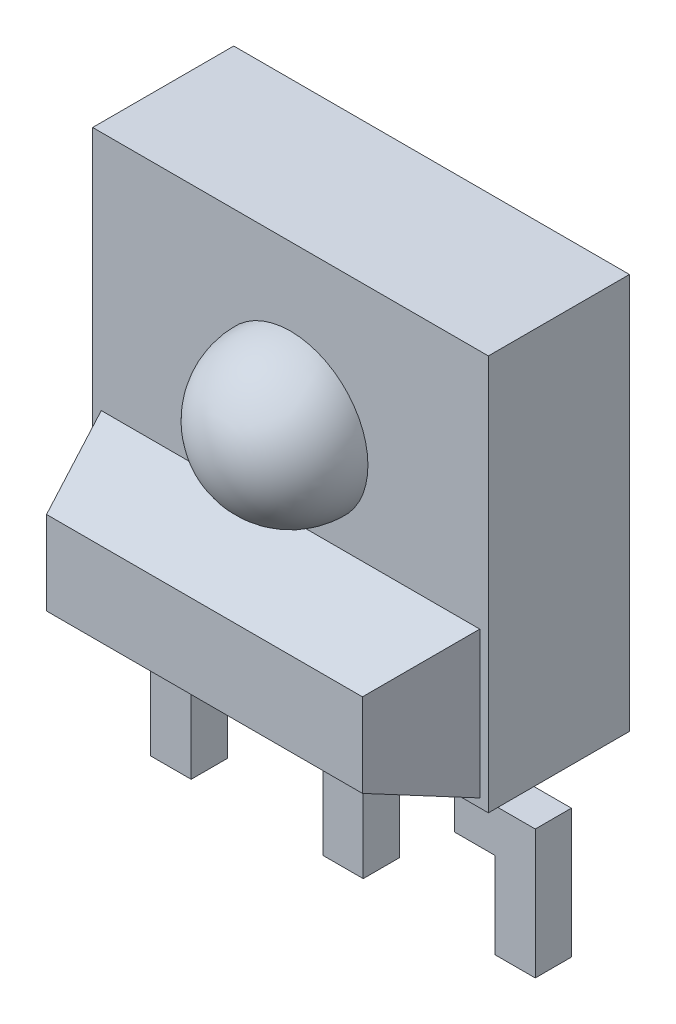
ISO-10303-21;
HEADER;
FILE_DESCRIPTION(('STEP AP214'),'2;1');
FILE_NAME('part.step','',(''),(''),'','','');
FILE_SCHEMA(('AUTOMOTIVE_DESIGN { 1 0 10303 214 1 1 1 1 }'));
ENDSEC;
DATA;
#1=APPLICATION_CONTEXT('core data for automotive mechanical design processes');
#2=APPLICATION_PROTOCOL_DEFINITION('international standard','automotive_design',2000,#1);
#3=PRODUCT_CONTEXT('',#1,'mechanical');
#4=PRODUCT('Part','Part','',(#3));
#5=PRODUCT_RELATED_PRODUCT_CATEGORY('part','',(#4));
#6=PRODUCT_DEFINITION_FORMATION('','',#4);
#7=PRODUCT_DEFINITION_CONTEXT('part definition',#1,'design');
#8=PRODUCT_DEFINITION('design','',#6,#7);
#9=PRODUCT_DEFINITION_SHAPE('','',#8);
#10=(LENGTH_UNIT() NAMED_UNIT(*) SI_UNIT(.MILLI.,.METRE.));
#11=(NAMED_UNIT(*) PLANE_ANGLE_UNIT() SI_UNIT($,.RADIAN.));
#12=(NAMED_UNIT(*) SI_UNIT($,.STERADIAN.) SOLID_ANGLE_UNIT());
#13=UNCERTAINTY_MEASURE_WITH_UNIT(LENGTH_MEASURE(1.E-05),#10,'distance_accuracy_value','');
#14=(GEOMETRIC_REPRESENTATION_CONTEXT(3) GLOBAL_UNCERTAINTY_ASSIGNED_CONTEXT((#13)) GLOBAL_UNIT_ASSIGNED_CONTEXT((#10,
#11,#12)) REPRESENTATION_CONTEXT('',''));
#15=CARTESIAN_POINT('',(0.,0.,0.));
#16=DIRECTION('',(0.,0.,1.));
#17=DIRECTION('',(1.,0.,0.));
#18=AXIS2_PLACEMENT_3D('',#15,#16,#17);
#19=CARTESIAN_POINT('',(-2.3,5.6,0.82));
#20=DIRECTION('',(0.,0.,-1.));
#21=DIRECTION('',(-1.,0.,0.));
#22=AXIS2_PLACEMENT_3D('',#19,#20,#21);
#23=PLANE('',#22);
#24=CARTESIAN_POINT('',(0.,3.8,0.82));
#25=DIRECTION('',(0.,0.,-1.));
#26=DIRECTION('',(-1.,0.,0.));
#27=AXIS2_PLACEMENT_3D('',#24,#25,#26);
#28=CIRCLE('',#27,0.9);
#29=CARTESIAN_POINT('',(-0.9,3.8,0.82));
#30=VERTEX_POINT('',#29);
#31=EDGE_CURVE('E424',#30,#30,#28,.F.);
#32=ORIENTED_EDGE('',*,*,#31,.F.);
#33=EDGE_LOOP('',(#32));
#34=FACE_BOUND('',#33,.T.);
#35=DIRECTION('',(1.,0.,0.));
#36=VECTOR('',#35,1.);
#37=CARTESIAN_POINT('',(-2.3,0.999999999999998,0.82));
#38=LINE('',#37,#36);
#39=CARTESIAN_POINT('',(-2.3,0.999999999999998,0.82));
#40=VERTEX_POINT('',#39);
#41=CARTESIAN_POINT('',(2.3,0.999999999999998,0.82));
#42=VERTEX_POINT('',#41);
#43=EDGE_CURVE('E369',#40,#42,#38,.T.);
#44=ORIENTED_EDGE('',*,*,#43,.T.);
#45=DIRECTION('',(0.,-1.,0.));
#46=VECTOR('',#45,1.);
#47=CARTESIAN_POINT('',(2.3,5.6,0.82));
#48=LINE('',#47,#46);
#49=CARTESIAN_POINT('',(2.3,5.6,0.82));
#50=VERTEX_POINT('',#49);
#51=EDGE_CURVE('E375',#50,#42,#48,.T.);
#52=ORIENTED_EDGE('',*,*,#51,.F.);
#53=DIRECTION('',(1.,0.,0.));
#54=VECTOR('',#53,1.);
#55=CARTESIAN_POINT('',(-2.3,5.6,0.82));
#56=LINE('',#55,#54);
#57=CARTESIAN_POINT('',(-2.3,5.6,0.82));
#58=VERTEX_POINT('',#57);
#59=EDGE_CURVE('E373',#58,#50,#56,.T.);
#60=ORIENTED_EDGE('',*,*,#59,.F.);
#61=DIRECTION('',(0.,-1.,0.));
#62=VECTOR('',#61,1.);
#63=CARTESIAN_POINT('',(-2.3,5.6,0.82));
#64=LINE('',#63,#62);
#65=EDGE_CURVE('E385',#58,#40,#64,.T.);
#66=ORIENTED_EDGE('',*,*,#65,.T.);
#67=EDGE_LOOP('',(#44,#52,#60,#66));
#68=FACE_BOUND('',#67,.T.);
#69=DIRECTION('',(0.,1.,0.));
#70=VECTOR('',#69,1.);
#71=CARTESIAN_POINT('',(2.2,2.8,0.82));
#72=LINE('',#71,#70);
#73=CARTESIAN_POINT('',(2.2,1.1,0.82));
#74=VERTEX_POINT('',#73);
#75=CARTESIAN_POINT('',(2.2,2.8,0.82));
#76=VERTEX_POINT('',#75);
#77=EDGE_CURVE('E220',#74,#76,#72,.T.);
#78=ORIENTED_EDGE('',*,*,#77,.F.);
#79=DIRECTION('',(1.,0.,0.));
#80=VECTOR('',#79,1.);
#81=CARTESIAN_POINT('',(-2.2,1.1,0.82));
#82=LINE('',#81,#80);
#83=CARTESIAN_POINT('',(-2.2,1.1,0.82));
#84=VERTEX_POINT('',#83);
#85=EDGE_CURVE('E221',#84,#74,#82,.T.);
#86=ORIENTED_EDGE('',*,*,#85,.F.);
#87=DIRECTION('',(0.,-1.,0.));
#88=VECTOR('',#87,1.);
#89=CARTESIAN_POINT('',(-2.2,2.8,0.82));
#90=LINE('',#89,#88);
#91=CARTESIAN_POINT('',(-2.2,2.8,0.82));
#92=VERTEX_POINT('',#91);
#93=EDGE_CURVE('E232',#92,#84,#90,.T.);
#94=ORIENTED_EDGE('',*,*,#93,.F.);
#95=DIRECTION('',(-1.,0.,0.));
#96=VECTOR('',#95,1.);
#97=CARTESIAN_POINT('',(-2.2,2.8,0.82));
#98=LINE('',#97,#96);
#99=EDGE_CURVE('E223',#76,#92,#98,.T.);
#100=ORIENTED_EDGE('',*,*,#99,.F.);
#101=EDGE_LOOP('',(#78,#86,#94,#100));
#102=FACE_BOUND('',#101,.T.);
#103=ADVANCED_FACE('F32',(#34,#68,#102),#23,.F.);
#104=CARTESIAN_POINT('',(0.,0.999999999999998,0.));
#105=DIRECTION('',(0.,1.,0.));
#106=DIRECTION('',(0.,0.,1.));
#107=AXIS2_PLACEMENT_3D('',#104,#105,#106);
#108=PLANE('',#107);
#109=DIRECTION('',(0.,0.,-1.));
#110=VECTOR('',#109,1.);
#111=CARTESIAN_POINT('',(1.295,0.999999999999998,0.21));
#112=LINE('',#111,#110);
#113=CARTESIAN_POINT('',(1.295,0.999999999999998,0.21));
#114=VERTEX_POINT('',#113);
#115=CARTESIAN_POINT('',(1.295,0.999999999999998,-0.21));
#116=VERTEX_POINT('',#115);
#117=EDGE_CURVE('E302',#114,#116,#112,.T.);
#118=ORIENTED_EDGE('',*,*,#117,.F.);
#119=DIRECTION('',(-1.,0.,0.));
#120=VECTOR('',#119,1.);
#121=CARTESIAN_POINT('',(1.765,0.999999999999998,0.21));
#122=LINE('',#121,#120);
#123=CARTESIAN_POINT('',(1.765,0.999999999999998,0.21));
#124=VERTEX_POINT('',#123);
#125=EDGE_CURVE('E253',#124,#114,#122,.T.);
#126=ORIENTED_EDGE('',*,*,#125,.F.);
#127=DIRECTION('',(0.,0.,-1.));
#128=VECTOR('',#127,1.);
#129=CARTESIAN_POINT('',(1.765,0.999999999999998,0.21));
#130=LINE('',#129,#128);
#131=CARTESIAN_POINT('',(1.765,0.999999999999998,-0.21));
#132=VERTEX_POINT('',#131);
#133=EDGE_CURVE('E305',#124,#132,#130,.T.);
#134=ORIENTED_EDGE('',*,*,#133,.T.);
#135=DIRECTION('',(-1.,0.,0.));
#136=VECTOR('',#135,1.);
#137=CARTESIAN_POINT('',(1.765,0.999999999999998,-0.21));
#138=LINE('',#137,#136);
#139=EDGE_CURVE('E272',#132,#116,#138,.T.);
#140=ORIENTED_EDGE('',*,*,#139,.T.);
#141=EDGE_LOOP('',(#118,#126,#134,#140));
#142=FACE_BOUND('',#141,.T.);
#143=DIRECTION('',(0.,0.,-1.));
#144=VECTOR('',#143,1.);
#145=CARTESIAN_POINT('',(2.3,0.999999999999998,-0.82));
#146=LINE('',#145,#144);
#147=CARTESIAN_POINT('',(2.3,0.999999999999998,-0.82));
#148=VERTEX_POINT('',#147);
#149=EDGE_CURVE('E364',#42,#148,#146,.T.);
#150=ORIENTED_EDGE('',*,*,#149,.F.);
#151=ORIENTED_EDGE('',*,*,#43,.F.);
#152=DIRECTION('',(0.,0.,1.));
#153=VECTOR('',#152,1.);
#154=CARTESIAN_POINT('',(-2.3,0.999999999999998,-0.82));
#155=LINE('',#154,#153);
#156=CARTESIAN_POINT('',(-2.3,0.999999999999998,-0.82));
#157=VERTEX_POINT('',#156);
#158=EDGE_CURVE('E380',#157,#40,#155,.T.);
#159=ORIENTED_EDGE('',*,*,#158,.F.);
#160=DIRECTION('',(-1.,0.,0.));
#161=VECTOR('',#160,1.);
#162=CARTESIAN_POINT('',(-2.3,0.999999999999998,-0.82));
#163=LINE('',#162,#161);
#164=EDGE_CURVE('E378',#148,#157,#163,.T.);
#165=ORIENTED_EDGE('',*,*,#164,.F.);
#166=EDGE_LOOP('',(#150,#151,#159,#165));
#167=FACE_BOUND('',#166,.T.);
#168=DIRECTION('',(-1.,0.,0.));
#169=VECTOR('',#168,1.);
#170=CARTESIAN_POINT('',(-0.234999999999999,0.999999999999998,0.21));
#171=LINE('',#170,#169);
#172=CARTESIAN_POINT('',(0.234999999999999,0.999999999999998,0.21));
#173=VERTEX_POINT('',#172);
#174=CARTESIAN_POINT('',(-0.234999999999999,0.999999999999998,0.21));
#175=VERTEX_POINT('',#174);
#176=EDGE_CURVE('E397',#173,#175,#171,.T.);
#177=ORIENTED_EDGE('',*,*,#176,.F.);
#178=DIRECTION('',(0.,0.,-1.));
#179=VECTOR('',#178,1.);
#180=CARTESIAN_POINT('',(0.234999999999999,0.999999999999998,0.21));
#181=LINE('',#180,#179);
#182=CARTESIAN_POINT('',(0.234999999999999,0.999999999999998,-0.21));
#183=VERTEX_POINT('',#182);
#184=EDGE_CURVE('E421',#173,#183,#181,.T.);
#185=ORIENTED_EDGE('',*,*,#184,.T.);
#186=DIRECTION('',(-1.,0.,0.));
#187=VECTOR('',#186,1.);
#188=CARTESIAN_POINT('',(-0.234999999999999,0.999999999999998,-0.21));
#189=LINE('',#188,#187);
#190=CARTESIAN_POINT('',(-0.235000000000001,0.999999999999998,-0.21));
#191=VERTEX_POINT('',#190);
#192=EDGE_CURVE('E407',#183,#191,#189,.T.);
#193=ORIENTED_EDGE('',*,*,#192,.T.);
#194=DIRECTION('',(0.,0.,-1.));
#195=VECTOR('',#194,1.);
#196=CARTESIAN_POINT('',(-0.234999999999999,0.999999999999998,0.21));
#197=LINE('',#196,#195);
#198=EDGE_CURVE('E418',#175,#191,#197,.T.);
#199=ORIENTED_EDGE('',*,*,#198,.F.);
#200=EDGE_LOOP('',(#177,#185,#193,#199));
#201=FACE_BOUND('',#200,.T.);
#202=DIRECTION('',(-1.,0.,0.));
#203=VECTOR('',#202,1.);
#204=CARTESIAN_POINT('',(-1.765,0.999999999999998,0.21));
#205=LINE('',#204,#203);
#206=CARTESIAN_POINT('',(-1.295,0.999999999999998,0.21));
#207=VERTEX_POINT('',#206);
#208=CARTESIAN_POINT('',(-1.765,0.999999999999998,0.21));
#209=VERTEX_POINT('',#208);
#210=EDGE_CURVE('E308',#207,#209,#205,.T.);
#211=ORIENTED_EDGE('',*,*,#210,.F.);
#212=DIRECTION('',(0.,0.,-1.));
#213=VECTOR('',#212,1.);
#214=CARTESIAN_POINT('',(-1.295,0.999999999999998,0.21));
#215=LINE('',#214,#213);
#216=CARTESIAN_POINT('',(-1.295,0.999999999999998,-0.21));
#217=VERTEX_POINT('',#216);
#218=EDGE_CURVE('E326',#207,#217,#215,.T.);
#219=ORIENTED_EDGE('',*,*,#218,.T.);
#220=DIRECTION('',(-1.,0.,0.));
#221=VECTOR('',#220,1.);
#222=CARTESIAN_POINT('',(-1.765,0.999999999999998,-0.21));
#223=LINE('',#222,#221);
#224=CARTESIAN_POINT('',(-1.765,0.999999999999998,-0.21));
#225=VERTEX_POINT('',#224);
#226=EDGE_CURVE('E307',#217,#225,#223,.T.);
#227=ORIENTED_EDGE('',*,*,#226,.T.);
#228=DIRECTION('',(0.,0.,-1.));
#229=VECTOR('',#228,1.);
#230=CARTESIAN_POINT('',(-1.765,0.999999999999998,0.21));
#231=LINE('',#230,#229);
#232=EDGE_CURVE('E362',#209,#225,#231,.T.);
#233=ORIENTED_EDGE('',*,*,#232,.F.);
#234=EDGE_LOOP('',(#211,#219,#227,#233));
#235=FACE_BOUND('',#234,.T.);
#236=ADVANCED_FACE('F440',(#142,#167,#201,#235),#108,.F.);
#237=CARTESIAN_POINT('',(0.234999999999999,0.999999999999998,0.21));
#238=DIRECTION('',(-1.,0.,0.));
#239=DIRECTION('',(0.,-1.,0.));
#240=AXIS2_PLACEMENT_3D('',#237,#238,#239);
#241=PLANE('',#240);
#242=DIRECTION('',(0.,1.,0.));
#243=VECTOR('',#242,1.);
#244=CARTESIAN_POINT('',(0.234999999999999,0.999999999999998,-0.21));
#245=LINE('',#244,#243);
#246=CARTESIAN_POINT('',(0.234999999999999,-1.,-0.21));
#247=VERTEX_POINT('',#246);
#248=EDGE_CURVE('E394',#247,#183,#245,.T.);
#249=ORIENTED_EDGE('',*,*,#248,.T.);
#250=ORIENTED_EDGE('',*,*,#184,.F.);
#251=DIRECTION('',(0.,1.,0.));
#252=VECTOR('',#251,1.);
#253=CARTESIAN_POINT('',(0.234999999999999,0.999999999999998,0.21));
#254=LINE('',#253,#252);
#255=CARTESIAN_POINT('',(0.234999999999999,-1.,0.21));
#256=VERTEX_POINT('',#255);
#257=EDGE_CURVE('E395',#256,#173,#254,.T.);
#258=ORIENTED_EDGE('',*,*,#257,.F.);
#259=DIRECTION('',(0.,0.,-1.));
#260=VECTOR('',#259,1.);
#261=CARTESIAN_POINT('',(0.234999999999999,-1.,0.21));
#262=LINE('',#261,#260);
#263=EDGE_CURVE('E404',#256,#247,#262,.T.);
#264=ORIENTED_EDGE('',*,*,#263,.T.);
#265=EDGE_LOOP('',(#249,#250,#258,#264));
#266=FACE_BOUND('',#265,.T.);
#267=ADVANCED_FACE('F446',(#266),#241,.F.);
#268=CARTESIAN_POINT('',(-0.234999999999999,0.999999999999998,0.21));
#269=DIRECTION('',(1.,0.,0.));
#270=DIRECTION('',(0.,1.,0.));
#271=AXIS2_PLACEMENT_3D('',#268,#269,#270);
#272=PLANE('',#271);
#273=DIRECTION('',(0.,-1.,0.));
#274=VECTOR('',#273,1.);
#275=CARTESIAN_POINT('',(-0.234999999999999,0.999999999999998,-0.21));
#276=LINE('',#275,#274);
#277=CARTESIAN_POINT('',(-0.235000000000001,-1.,-0.21));
#278=VERTEX_POINT('',#277);
#279=EDGE_CURVE('E410',#191,#278,#276,.T.);
#280=ORIENTED_EDGE('',*,*,#279,.T.);
#281=DIRECTION('',(0.,0.,-1.));
#282=VECTOR('',#281,1.);
#283=CARTESIAN_POINT('',(-0.235000000000001,-1.,0.21));
#284=LINE('',#283,#282);
#285=CARTESIAN_POINT('',(-0.235000000000001,-1.,0.21));
#286=VERTEX_POINT('',#285);
#287=EDGE_CURVE('E415',#286,#278,#284,.T.);
#288=ORIENTED_EDGE('',*,*,#287,.F.);
#289=DIRECTION('',(0.,-1.,0.));
#290=VECTOR('',#289,1.);
#291=CARTESIAN_POINT('',(-0.234999999999999,0.999999999999998,0.21));
#292=LINE('',#291,#290);
#293=EDGE_CURVE('E400',#175,#286,#292,.T.);
#294=ORIENTED_EDGE('',*,*,#293,.F.);
#295=ORIENTED_EDGE('',*,*,#198,.T.);
#296=EDGE_LOOP('',(#280,#288,#294,#295));
#297=FACE_BOUND('',#296,.T.);
#298=ADVANCED_FACE('F477',(#297),#272,.F.);
#299=CARTESIAN_POINT('',(-0.235000000000001,-1.,0.21));
#300=DIRECTION('',(0.,1.,0.));
#301=DIRECTION('',(0.,0.,1.));
#302=AXIS2_PLACEMENT_3D('',#299,#300,#301);
#303=PLANE('',#302);
#304=DIRECTION('',(1.,0.,0.));
#305=VECTOR('',#304,1.);
#306=CARTESIAN_POINT('',(-0.235000000000001,-1.,-0.21));
#307=LINE('',#306,#305);
#308=EDGE_CURVE('E398',#278,#247,#307,.T.);
#309=ORIENTED_EDGE('',*,*,#308,.T.);
#310=ORIENTED_EDGE('',*,*,#263,.F.);
#311=DIRECTION('',(1.,0.,0.));
#312=VECTOR('',#311,1.);
#313=CARTESIAN_POINT('',(-0.235000000000001,-1.,0.21));
#314=LINE('',#313,#312);
#315=EDGE_CURVE('E402',#286,#256,#314,.T.);
#316=ORIENTED_EDGE('',*,*,#315,.F.);
#317=ORIENTED_EDGE('',*,*,#287,.T.);
#318=EDGE_LOOP('',(#309,#310,#316,#317));
#319=FACE_BOUND('',#318,.T.);
#320=ADVANCED_FACE('F470',(#319),#303,.F.);
#321=CARTESIAN_POINT('',(0.,0.,0.21));
#322=DIRECTION('',(0.,0.,1.));
#323=DIRECTION('',(1.,0.,0.));
#324=AXIS2_PLACEMENT_3D('',#321,#322,#323);
#325=PLANE('',#324);
#326=ORIENTED_EDGE('',*,*,#257,.T.);
#327=ORIENTED_EDGE('',*,*,#176,.T.);
#328=ORIENTED_EDGE('',*,*,#293,.T.);
#329=ORIENTED_EDGE('',*,*,#315,.T.);
#330=EDGE_LOOP('',(#326,#327,#328,#329));
#331=FACE_BOUND('',#330,.T.);
#332=ADVANCED_FACE('F467',(#331),#325,.T.);
#333=CARTESIAN_POINT('',(0.,0.,-0.21));
#334=DIRECTION('',(0.,0.,1.));
#335=DIRECTION('',(1.,0.,0.));
#336=AXIS2_PLACEMENT_3D('',#333,#334,#335);
#337=PLANE('',#336);
#338=ORIENTED_EDGE('',*,*,#248,.F.);
#339=ORIENTED_EDGE('',*,*,#308,.F.);
#340=ORIENTED_EDGE('',*,*,#279,.F.);
#341=ORIENTED_EDGE('',*,*,#192,.F.);
#342=EDGE_LOOP('',(#338,#339,#340,#341));
#343=FACE_BOUND('',#342,.T.);
#344=ADVANCED_FACE('F465',(#343),#337,.F.);
#345=CARTESIAN_POINT('',(2.3,5.6,-0.82));
#346=DIRECTION('',(-1.,0.,0.));
#347=DIRECTION('',(0.,0.,1.));
#348=AXIS2_PLACEMENT_3D('',#345,#346,#347);
#349=PLANE('',#348);
#350=ORIENTED_EDGE('',*,*,#149,.T.);
#351=DIRECTION('',(0.,-1.,0.));
#352=VECTOR('',#351,1.);
#353=CARTESIAN_POINT('',(2.3,5.6,-0.82));
#354=LINE('',#353,#352);
#355=CARTESIAN_POINT('',(2.3,5.6,-0.82));
#356=VERTEX_POINT('',#355);
#357=EDGE_CURVE('E391',#356,#148,#354,.T.);
#358=ORIENTED_EDGE('',*,*,#357,.F.);
#359=DIRECTION('',(0.,0.,-1.));
#360=VECTOR('',#359,1.);
#361=CARTESIAN_POINT('',(2.3,5.6,-0.82));
#362=LINE('',#361,#360);
#363=EDGE_CURVE('E365',#50,#356,#362,.T.);
#364=ORIENTED_EDGE('',*,*,#363,.F.);
#365=ORIENTED_EDGE('',*,*,#51,.T.);
#366=EDGE_LOOP('',(#350,#358,#364,#365));
#367=FACE_BOUND('',#366,.T.);
#368=ADVANCED_FACE('F461',(#367),#349,.F.);
#369=CARTESIAN_POINT('',(-2.3,5.6,-0.82));
#370=DIRECTION('',(0.,0.,1.));
#371=DIRECTION('',(1.,0.,0.));
#372=AXIS2_PLACEMENT_3D('',#369,#370,#371);
#373=PLANE('',#372);
#374=ORIENTED_EDGE('',*,*,#164,.T.);
#375=DIRECTION('',(0.,-1.,0.));
#376=VECTOR('',#375,1.);
#377=CARTESIAN_POINT('',(-2.3,5.6,-0.82));
#378=LINE('',#377,#376);
#379=CARTESIAN_POINT('',(-2.3,5.6,-0.82));
#380=VERTEX_POINT('',#379);
#381=EDGE_CURVE('E388',#380,#157,#378,.T.);
#382=ORIENTED_EDGE('',*,*,#381,.F.);
#383=DIRECTION('',(-1.,0.,0.));
#384=VECTOR('',#383,1.);
#385=CARTESIAN_POINT('',(-2.3,5.6,-0.82));
#386=LINE('',#385,#384);
#387=EDGE_CURVE('E368',#356,#380,#386,.T.);
#388=ORIENTED_EDGE('',*,*,#387,.F.);
#389=ORIENTED_EDGE('',*,*,#357,.T.);
#390=EDGE_LOOP('',(#374,#382,#388,#389));
#391=FACE_BOUND('',#390,.T.);
#392=ADVANCED_FACE('F457',(#391),#373,.F.);
#393=CARTESIAN_POINT('',(-2.3,5.6,-0.82));
#394=DIRECTION('',(1.,0.,0.));
#395=DIRECTION('',(0.,0.,-1.));
#396=AXIS2_PLACEMENT_3D('',#393,#394,#395);
#397=PLANE('',#396);
#398=ORIENTED_EDGE('',*,*,#158,.T.);
#399=ORIENTED_EDGE('',*,*,#65,.F.);
#400=DIRECTION('',(0.,0.,1.));
#401=VECTOR('',#400,1.);
#402=CARTESIAN_POINT('',(-2.3,5.6,-0.82));
#403=LINE('',#402,#401);
#404=EDGE_CURVE('E371',#380,#58,#403,.T.);
#405=ORIENTED_EDGE('',*,*,#404,.F.);
#406=ORIENTED_EDGE('',*,*,#381,.T.);
#407=EDGE_LOOP('',(#398,#399,#405,#406));
#408=FACE_BOUND('',#407,.T.);
#409=ADVANCED_FACE('F453',(#408),#397,.F.);
#410=CARTESIAN_POINT('',(0.,5.6,0.));
#411=DIRECTION('',(0.,1.,0.));
#412=DIRECTION('',(0.,0.,1.));
#413=AXIS2_PLACEMENT_3D('',#410,#411,#412);
#414=PLANE('',#413);
#415=ORIENTED_EDGE('',*,*,#363,.T.);
#416=ORIENTED_EDGE('',*,*,#387,.T.);
#417=ORIENTED_EDGE('',*,*,#404,.T.);
#418=ORIENTED_EDGE('',*,*,#59,.T.);
#419=EDGE_LOOP('',(#415,#416,#417,#418));
#420=FACE_BOUND('',#419,.T.);
#421=ADVANCED_FACE('F456',(#420),#414,.T.);
#422=CARTESIAN_POINT('',(-1.765,0.499999999999998,0.21));
#423=DIRECTION('',(1.,0.,0.));
#424=DIRECTION('',(0.,0.,-1.));
#425=AXIS2_PLACEMENT_3D('',#422,#423,#424);
#426=PLANE('',#425);
#427=DIRECTION('',(0.,-1.,0.));
#428=VECTOR('',#427,1.);
#429=CARTESIAN_POINT('',(-1.765,0.499999999999998,-0.21));
#430=LINE('',#429,#428);
#431=CARTESIAN_POINT('',(-1.765,0.499999999999998,-0.21));
#432=VERTEX_POINT('',#431);
#433=EDGE_CURVE('E329',#225,#432,#430,.T.);
#434=ORIENTED_EDGE('',*,*,#433,.T.);
#435=DIRECTION('',(0.,0.,-1.));
#436=VECTOR('',#435,1.);
#437=CARTESIAN_POINT('',(-1.765,0.499999999999998,0.21));
#438=LINE('',#437,#436);
#439=CARTESIAN_POINT('',(-1.765,0.499999999999998,0.21));
#440=VERTEX_POINT('',#439);
#441=EDGE_CURVE('E359',#440,#432,#438,.T.);
#442=ORIENTED_EDGE('',*,*,#441,.F.);
#443=DIRECTION('',(0.,-1.,0.));
#444=VECTOR('',#443,1.);
#445=CARTESIAN_POINT('',(-1.765,0.499999999999998,0.21));
#446=LINE('',#445,#444);
#447=EDGE_CURVE('E311',#209,#440,#446,.T.);
#448=ORIENTED_EDGE('',*,*,#447,.F.);
#449=ORIENTED_EDGE('',*,*,#232,.T.);
#450=EDGE_LOOP('',(#434,#442,#448,#449));
#451=FACE_BOUND('',#450,.T.);
#452=ADVANCED_FACE('F533',(#451),#426,.F.);
#453=CARTESIAN_POINT('',(-2.235,0.499999999999998,0.21));
#454=DIRECTION('',(0.,-1.,0.));
#455=DIRECTION('',(0.,0.,-1.));
#456=AXIS2_PLACEMENT_3D('',#453,#454,#455);
#457=PLANE('',#456);
#458=DIRECTION('',(-1.,0.,0.));
#459=VECTOR('',#458,1.);
#460=CARTESIAN_POINT('',(-2.235,0.499999999999998,-0.21));
#461=LINE('',#460,#459);
#462=CARTESIAN_POINT('',(-2.235,0.499999999999998,-0.21));
#463=VERTEX_POINT('',#462);
#464=EDGE_CURVE('E331',#432,#463,#461,.T.);
#465=ORIENTED_EDGE('',*,*,#464,.T.);
#466=DIRECTION('',(0.,0.,-1.));
#467=VECTOR('',#466,1.);
#468=CARTESIAN_POINT('',(-2.235,0.499999999999998,0.21));
#469=LINE('',#468,#467);
#470=CARTESIAN_POINT('',(-2.235,0.499999999999998,0.21));
#471=VERTEX_POINT('',#470);
#472=EDGE_CURVE('E356',#471,#463,#469,.T.);
#473=ORIENTED_EDGE('',*,*,#472,.F.);
#474=DIRECTION('',(-1.,0.,0.));
#475=VECTOR('',#474,1.);
#476=CARTESIAN_POINT('',(-2.235,0.499999999999998,0.21));
#477=LINE('',#476,#475);
#478=EDGE_CURVE('E314',#440,#471,#477,.T.);
#479=ORIENTED_EDGE('',*,*,#478,.F.);
#480=ORIENTED_EDGE('',*,*,#441,.T.);
#481=EDGE_LOOP('',(#465,#473,#479,#480));
#482=FACE_BOUND('',#481,.T.);
#483=ADVANCED_FACE('F699',(#482),#457,.F.);
#484=CARTESIAN_POINT('',(-2.235,-1.,0.21));
#485=DIRECTION('',(1.,0.,0.));
#486=DIRECTION('',(0.,0.,-1.));
#487=AXIS2_PLACEMENT_3D('',#484,#485,#486);
#488=PLANE('',#487);
#489=DIRECTION('',(0.,-1.,0.));
#490=VECTOR('',#489,1.);
#491=CARTESIAN_POINT('',(-2.235,-1.,-0.21));
#492=LINE('',#491,#490);
#493=CARTESIAN_POINT('',(-2.235,-1.,-0.21));
#494=VERTEX_POINT('',#493);
#495=EDGE_CURVE('E333',#463,#494,#492,.T.);
#496=ORIENTED_EDGE('',*,*,#495,.T.);
#497=DIRECTION('',(0.,0.,-1.));
#498=VECTOR('',#497,1.);
#499=CARTESIAN_POINT('',(-2.235,-1.,0.21));
#500=LINE('',#499,#498);
#501=CARTESIAN_POINT('',(-2.235,-1.,0.21));
#502=VERTEX_POINT('',#501);
#503=EDGE_CURVE('E353',#502,#494,#500,.T.);
#504=ORIENTED_EDGE('',*,*,#503,.F.);
#505=DIRECTION('',(0.,-1.,0.));
#506=VECTOR('',#505,1.);
#507=CARTESIAN_POINT('',(-2.235,-1.,0.21));
#508=LINE('',#507,#506);
#509=EDGE_CURVE('E316',#471,#502,#508,.T.);
#510=ORIENTED_EDGE('',*,*,#509,.F.);
#511=ORIENTED_EDGE('',*,*,#472,.T.);
#512=EDGE_LOOP('',(#496,#504,#510,#511));
#513=FACE_BOUND('',#512,.T.);
#514=ADVANCED_FACE('F690',(#513),#488,.F.);
#515=CARTESIAN_POINT('',(-1.765,-1.,0.21));
#516=DIRECTION('',(0.,1.,0.));
#517=DIRECTION('',(0.,0.,1.));
#518=AXIS2_PLACEMENT_3D('',#515,#516,#517);
#519=PLANE('',#518);
#520=DIRECTION('',(1.,0.,0.));
#521=VECTOR('',#520,1.);
#522=CARTESIAN_POINT('',(-1.765,-1.,-0.21));
#523=LINE('',#522,#521);
#524=CARTESIAN_POINT('',(-1.765,-1.,-0.21));
#525=VERTEX_POINT('',#524);
#526=EDGE_CURVE('E335',#494,#525,#523,.T.);
#527=ORIENTED_EDGE('',*,*,#526,.T.);
#528=DIRECTION('',(0.,0.,-1.));
#529=VECTOR('',#528,1.);
#530=CARTESIAN_POINT('',(-1.765,-1.,0.21));
#531=LINE('',#530,#529);
#532=CARTESIAN_POINT('',(-1.765,-1.,0.21));
#533=VERTEX_POINT('',#532);
#534=EDGE_CURVE('E350',#533,#525,#531,.T.);
#535=ORIENTED_EDGE('',*,*,#534,.F.);
#536=DIRECTION('',(1.,0.,0.));
#537=VECTOR('',#536,1.);
#538=CARTESIAN_POINT('',(-1.765,-1.,0.21));
#539=LINE('',#538,#537);
#540=EDGE_CURVE('E318',#502,#533,#539,.T.);
#541=ORIENTED_EDGE('',*,*,#540,.F.);
#542=ORIENTED_EDGE('',*,*,#503,.T.);
#543=EDGE_LOOP('',(#527,#535,#541,#542));
#544=FACE_BOUND('',#543,.T.);
#545=ADVANCED_FACE('F681',(#544),#519,.F.);
#546=CARTESIAN_POINT('',(-1.765,0.,0.21));
#547=DIRECTION('',(-1.,0.,0.));
#548=DIRECTION('',(0.,0.,1.));
#549=AXIS2_PLACEMENT_3D('',#546,#547,#548);
#550=PLANE('',#549);
#551=DIRECTION('',(0.,1.,0.));
#552=VECTOR('',#551,1.);
#553=CARTESIAN_POINT('',(-1.765,0.,-0.21));
#554=LINE('',#553,#552);
#555=CARTESIAN_POINT('',(-1.765,0.,-0.21));
#556=VERTEX_POINT('',#555);
#557=EDGE_CURVE('E337',#525,#556,#554,.T.);
#558=ORIENTED_EDGE('',*,*,#557,.T.);
#559=DIRECTION('',(0.,0.,-1.));
#560=VECTOR('',#559,1.);
#561=CARTESIAN_POINT('',(-1.765,0.,0.21));
#562=LINE('',#561,#560);
#563=CARTESIAN_POINT('',(-1.765,0.,0.21));
#564=VERTEX_POINT('',#563);
#565=EDGE_CURVE('E347',#564,#556,#562,.T.);
#566=ORIENTED_EDGE('',*,*,#565,.F.);
#567=DIRECTION('',(0.,1.,0.));
#568=VECTOR('',#567,1.);
#569=CARTESIAN_POINT('',(-1.765,0.,0.21));
#570=LINE('',#569,#568);
#571=EDGE_CURVE('E320',#533,#564,#570,.T.);
#572=ORIENTED_EDGE('',*,*,#571,.F.);
#573=ORIENTED_EDGE('',*,*,#534,.T.);
#574=EDGE_LOOP('',(#558,#566,#572,#573));
#575=FACE_BOUND('',#574,.T.);
#576=ADVANCED_FACE('F672',(#575),#550,.F.);
#577=CARTESIAN_POINT('',(-1.295,0.,0.21));
#578=DIRECTION('',(0.,1.,0.));
#579=DIRECTION('',(0.,0.,1.));
#580=AXIS2_PLACEMENT_3D('',#577,#578,#579);
#581=PLANE('',#580);
#582=DIRECTION('',(1.,0.,0.));
#583=VECTOR('',#582,1.);
#584=CARTESIAN_POINT('',(-1.295,0.,-0.21));
#585=LINE('',#584,#583);
#586=CARTESIAN_POINT('',(-1.295,0.,-0.21));
#587=VERTEX_POINT('',#586);
#588=EDGE_CURVE('E339',#556,#587,#585,.T.);
#589=ORIENTED_EDGE('',*,*,#588,.T.);
#590=DIRECTION('',(0.,0.,-1.));
#591=VECTOR('',#590,1.);
#592=CARTESIAN_POINT('',(-1.295,0.,0.21));
#593=LINE('',#592,#591);
#594=CARTESIAN_POINT('',(-1.295,0.,0.21));
#595=VERTEX_POINT('',#594);
#596=EDGE_CURVE('E344',#595,#587,#593,.T.);
#597=ORIENTED_EDGE('',*,*,#596,.F.);
#598=DIRECTION('',(1.,0.,0.));
#599=VECTOR('',#598,1.);
#600=CARTESIAN_POINT('',(-1.295,0.,0.21));
#601=LINE('',#600,#599);
#602=EDGE_CURVE('E322',#564,#595,#601,.T.);
#603=ORIENTED_EDGE('',*,*,#602,.F.);
#604=ORIENTED_EDGE('',*,*,#565,.T.);
#605=EDGE_LOOP('',(#589,#597,#603,#604));
#606=FACE_BOUND('',#605,.T.);
#607=ADVANCED_FACE('F663',(#606),#581,.F.);
#608=CARTESIAN_POINT('',(-1.295,0.999999999999998,0.21));
#609=DIRECTION('',(-1.,0.,0.));
#610=DIRECTION('',(0.,-1.,0.));
#611=AXIS2_PLACEMENT_3D('',#608,#609,#610);
#612=PLANE('',#611);
#613=DIRECTION('',(0.,1.,0.));
#614=VECTOR('',#613,1.);
#615=CARTESIAN_POINT('',(-1.295,0.999999999999998,-0.21));
#616=LINE('',#615,#614);
#617=EDGE_CURVE('E312',#587,#217,#616,.T.);
#618=ORIENTED_EDGE('',*,*,#617,.T.);
#619=ORIENTED_EDGE('',*,*,#218,.F.);
#620=DIRECTION('',(0.,1.,0.));
#621=VECTOR('',#620,1.);
#622=CARTESIAN_POINT('',(-1.295,0.999999999999998,0.21));
#623=LINE('',#622,#621);
#624=EDGE_CURVE('E324',#595,#207,#623,.T.);
#625=ORIENTED_EDGE('',*,*,#624,.F.);
#626=ORIENTED_EDGE('',*,*,#596,.T.);
#627=EDGE_LOOP('',(#618,#619,#625,#626));
#628=FACE_BOUND('',#627,.T.);
#629=ADVANCED_FACE('F654',(#628),#612,.F.);
#630=CARTESIAN_POINT('',(0.,0.,0.21));
#631=DIRECTION('',(0.,0.,-1.));
#632=DIRECTION('',(-1.,0.,0.));
#633=AXIS2_PLACEMENT_3D('',#630,#631,#632);
#634=PLANE('',#633);
#635=ORIENTED_EDGE('',*,*,#210,.T.);
#636=ORIENTED_EDGE('',*,*,#447,.T.);
#637=ORIENTED_EDGE('',*,*,#478,.T.);
#638=ORIENTED_EDGE('',*,*,#509,.T.);
#639=ORIENTED_EDGE('',*,*,#540,.T.);
#640=ORIENTED_EDGE('',*,*,#571,.T.);
#641=ORIENTED_EDGE('',*,*,#602,.T.);
#642=ORIENTED_EDGE('',*,*,#624,.T.);
#643=EDGE_LOOP('',(#635,#636,#637,#638,#639,#640,#641,#642));
#644=FACE_BOUND('',#643,.T.);
#645=ADVANCED_FACE('F645',(#644),#634,.F.);
#646=CARTESIAN_POINT('',(0.,0.,-0.21));
#647=DIRECTION('',(0.,0.,-1.));
#648=DIRECTION('',(-1.,0.,0.));
#649=AXIS2_PLACEMENT_3D('',#646,#647,#648);
#650=PLANE('',#649);
#651=ORIENTED_EDGE('',*,*,#226,.F.);
#652=ORIENTED_EDGE('',*,*,#617,.F.);
#653=ORIENTED_EDGE('',*,*,#588,.F.);
#654=ORIENTED_EDGE('',*,*,#557,.F.);
#655=ORIENTED_EDGE('',*,*,#526,.F.);
#656=ORIENTED_EDGE('',*,*,#495,.F.);
#657=ORIENTED_EDGE('',*,*,#464,.F.);
#658=ORIENTED_EDGE('',*,*,#433,.F.);
#659=EDGE_LOOP('',(#651,#652,#653,#654,#655,#656,#657,#658));
#660=FACE_BOUND('',#659,.T.);
#661=ADVANCED_FACE('F636',(#660),#650,.T.);
#662=CARTESIAN_POINT('',(1.765,0.499999999999998,0.21));
#663=DIRECTION('',(-1.,0.,0.));
#664=DIRECTION('',(0.,0.,1.));
#665=AXIS2_PLACEMENT_3D('',#662,#663,#664);
#666=PLANE('',#665);
#667=DIRECTION('',(0.,1.,0.));
#668=VECTOR('',#667,1.);
#669=CARTESIAN_POINT('',(1.765,0.499999999999998,-0.21));
#670=LINE('',#669,#668);
#671=CARTESIAN_POINT('',(1.765,0.499999999999998,-0.21));
#672=VERTEX_POINT('',#671);
#673=EDGE_CURVE('E231',#672,#132,#670,.T.);
#674=ORIENTED_EDGE('',*,*,#673,.T.);
#675=ORIENTED_EDGE('',*,*,#133,.F.);
#676=DIRECTION('',(0.,1.,0.));
#677=VECTOR('',#676,1.);
#678=CARTESIAN_POINT('',(1.765,0.499999999999998,0.21));
#679=LINE('',#678,#677);
#680=CARTESIAN_POINT('',(1.765,0.499999999999998,0.21));
#681=VERTEX_POINT('',#680);
#682=EDGE_CURVE('E250',#681,#124,#679,.T.);
#683=ORIENTED_EDGE('',*,*,#682,.F.);
#684=DIRECTION('',(0.,0.,-1.));
#685=VECTOR('',#684,1.);
#686=CARTESIAN_POINT('',(1.765,0.499999999999998,0.21));
#687=LINE('',#686,#685);
#688=EDGE_CURVE('E269',#681,#672,#687,.T.);
#689=ORIENTED_EDGE('',*,*,#688,.T.);
#690=EDGE_LOOP('',(#674,#675,#683,#689));
#691=FACE_BOUND('',#690,.T.);
#692=ADVANCED_FACE('F627',(#691),#666,.F.);
#693=CARTESIAN_POINT('',(1.295,0.999999999999998,0.21));
#694=DIRECTION('',(1.,0.,0.));
#695=DIRECTION('',(0.,1.,0.));
#696=AXIS2_PLACEMENT_3D('',#693,#694,#695);
#697=PLANE('',#696);
#698=DIRECTION('',(0.,-1.,0.));
#699=VECTOR('',#698,1.);
#700=CARTESIAN_POINT('',(1.295,0.999999999999998,-0.21));
#701=LINE('',#700,#699);
#702=CARTESIAN_POINT('',(1.295,0.,-0.21));
#703=VERTEX_POINT('',#702);
#704=EDGE_CURVE('E274',#116,#703,#701,.T.);
#705=ORIENTED_EDGE('',*,*,#704,.T.);
#706=DIRECTION('',(0.,0.,-1.));
#707=VECTOR('',#706,1.);
#708=CARTESIAN_POINT('',(1.295,0.,0.21));
#709=LINE('',#708,#707);
#710=CARTESIAN_POINT('',(1.295,0.,0.21));
#711=VERTEX_POINT('',#710);
#712=EDGE_CURVE('E299',#711,#703,#709,.T.);
#713=ORIENTED_EDGE('',*,*,#712,.F.);
#714=DIRECTION('',(0.,-1.,0.));
#715=VECTOR('',#714,1.);
#716=CARTESIAN_POINT('',(1.295,0.999999999999998,0.21));
#717=LINE('',#716,#715);
#718=EDGE_CURVE('E257',#114,#711,#717,.T.);
#719=ORIENTED_EDGE('',*,*,#718,.F.);
#720=ORIENTED_EDGE('',*,*,#117,.T.);
#721=EDGE_LOOP('',(#705,#713,#719,#720));
#722=FACE_BOUND('',#721,.T.);
#723=ADVANCED_FACE('F618',(#722),#697,.F.);
#724=CARTESIAN_POINT('',(1.295,0.,0.21));
#725=DIRECTION('',(0.,1.,0.));
#726=DIRECTION('',(0.,0.,1.));
#727=AXIS2_PLACEMENT_3D('',#724,#725,#726);
#728=PLANE('',#727);
#729=DIRECTION('',(1.,0.,0.));
#730=VECTOR('',#729,1.);
#731=CARTESIAN_POINT('',(1.295,0.,-0.21));
#732=LINE('',#731,#730);
#733=CARTESIAN_POINT('',(1.765,0.,-0.21));
#734=VERTEX_POINT('',#733);
#735=EDGE_CURVE('E276',#703,#734,#732,.T.);
#736=ORIENTED_EDGE('',*,*,#735,.T.);
#737=DIRECTION('',(0.,0.,-1.));
#738=VECTOR('',#737,1.);
#739=CARTESIAN_POINT('',(1.765,0.,0.21));
#740=LINE('',#739,#738);
#741=CARTESIAN_POINT('',(1.765,0.,0.21));
#742=VERTEX_POINT('',#741);
#743=EDGE_CURVE('E296',#742,#734,#740,.T.);
#744=ORIENTED_EDGE('',*,*,#743,.F.);
#745=DIRECTION('',(1.,0.,0.));
#746=VECTOR('',#745,1.);
#747=CARTESIAN_POINT('',(1.295,0.,0.21));
#748=LINE('',#747,#746);
#749=EDGE_CURVE('E259',#711,#742,#748,.T.);
#750=ORIENTED_EDGE('',*,*,#749,.F.);
#751=ORIENTED_EDGE('',*,*,#712,.T.);
#752=EDGE_LOOP('',(#736,#744,#750,#751));
#753=FACE_BOUND('',#752,.T.);
#754=ADVANCED_FACE('F609',(#753),#728,.F.);
#755=CARTESIAN_POINT('',(1.765,0.,0.21));
#756=DIRECTION('',(1.,0.,0.));
#757=DIRECTION('',(0.,0.,-1.));
#758=AXIS2_PLACEMENT_3D('',#755,#756,#757);
#759=PLANE('',#758);
#760=DIRECTION('',(0.,-1.,0.));
#761=VECTOR('',#760,1.);
#762=CARTESIAN_POINT('',(1.765,0.,-0.21));
#763=LINE('',#762,#761);
#764=CARTESIAN_POINT('',(1.765,-1.,-0.21));
#765=VERTEX_POINT('',#764);
#766=EDGE_CURVE('E278',#734,#765,#763,.T.);
#767=ORIENTED_EDGE('',*,*,#766,.T.);
#768=DIRECTION('',(0.,0.,-1.));
#769=VECTOR('',#768,1.);
#770=CARTESIAN_POINT('',(1.765,-1.,0.21));
#771=LINE('',#770,#769);
#772=CARTESIAN_POINT('',(1.765,-1.,0.21));
#773=VERTEX_POINT('',#772);
#774=EDGE_CURVE('E293',#773,#765,#771,.T.);
#775=ORIENTED_EDGE('',*,*,#774,.F.);
#776=DIRECTION('',(0.,-1.,0.));
#777=VECTOR('',#776,1.);
#778=CARTESIAN_POINT('',(1.765,0.,0.21));
#779=LINE('',#778,#777);
#780=EDGE_CURVE('E261',#742,#773,#779,.T.);
#781=ORIENTED_EDGE('',*,*,#780,.F.);
#782=ORIENTED_EDGE('',*,*,#743,.T.);
#783=EDGE_LOOP('',(#767,#775,#781,#782));
#784=FACE_BOUND('',#783,.T.);
#785=ADVANCED_FACE('F600',(#784),#759,.F.);
#786=CARTESIAN_POINT('',(1.765,-1.,0.21));
#787=DIRECTION('',(0.,1.,0.));
#788=DIRECTION('',(0.,0.,1.));
#789=AXIS2_PLACEMENT_3D('',#786,#787,#788);
#790=PLANE('',#789);
#791=DIRECTION('',(1.,0.,0.));
#792=VECTOR('',#791,1.);
#793=CARTESIAN_POINT('',(1.765,-1.,-0.21));
#794=LINE('',#793,#792);
#795=CARTESIAN_POINT('',(2.235,-1.,-0.21));
#796=VERTEX_POINT('',#795);
#797=EDGE_CURVE('E280',#765,#796,#794,.T.);
#798=ORIENTED_EDGE('',*,*,#797,.T.);
#799=DIRECTION('',(0.,0.,-1.));
#800=VECTOR('',#799,1.);
#801=CARTESIAN_POINT('',(2.235,-1.,0.21));
#802=LINE('',#801,#800);
#803=CARTESIAN_POINT('',(2.235,-1.,0.21));
#804=VERTEX_POINT('',#803);
#805=EDGE_CURVE('E290',#804,#796,#802,.T.);
#806=ORIENTED_EDGE('',*,*,#805,.F.);
#807=DIRECTION('',(1.,0.,0.));
#808=VECTOR('',#807,1.);
#809=CARTESIAN_POINT('',(1.765,-1.,0.21));
#810=LINE('',#809,#808);
#811=EDGE_CURVE('E263',#773,#804,#810,.T.);
#812=ORIENTED_EDGE('',*,*,#811,.F.);
#813=ORIENTED_EDGE('',*,*,#774,.T.);
#814=EDGE_LOOP('',(#798,#806,#812,#813));
#815=FACE_BOUND('',#814,.T.);
#816=ADVANCED_FACE('F591',(#815),#790,.F.);
#817=CARTESIAN_POINT('',(2.235,-1.,0.21));
#818=DIRECTION('',(-1.,0.,0.));
#819=DIRECTION('',(0.,0.,1.));
#820=AXIS2_PLACEMENT_3D('',#817,#818,#819);
#821=PLANE('',#820);
#822=DIRECTION('',(0.,1.,0.));
#823=VECTOR('',#822,1.);
#824=CARTESIAN_POINT('',(2.235,-1.,-0.21));
#825=LINE('',#824,#823);
#826=CARTESIAN_POINT('',(2.235,0.499999999999998,-0.21));
#827=VERTEX_POINT('',#826);
#828=EDGE_CURVE('E282',#796,#827,#825,.T.);
#829=ORIENTED_EDGE('',*,*,#828,.T.);
#830=DIRECTION('',(0.,0.,-1.));
#831=VECTOR('',#830,1.);
#832=CARTESIAN_POINT('',(2.235,0.499999999999998,0.21));
#833=LINE('',#832,#831);
#834=CARTESIAN_POINT('',(2.235,0.499999999999998,0.21));
#835=VERTEX_POINT('',#834);
#836=EDGE_CURVE('E287',#835,#827,#833,.T.);
#837=ORIENTED_EDGE('',*,*,#836,.F.);
#838=DIRECTION('',(0.,1.,0.));
#839=VECTOR('',#838,1.);
#840=CARTESIAN_POINT('',(2.235,-1.,0.21));
#841=LINE('',#840,#839);
#842=EDGE_CURVE('E265',#804,#835,#841,.T.);
#843=ORIENTED_EDGE('',*,*,#842,.F.);
#844=ORIENTED_EDGE('',*,*,#805,.T.);
#845=EDGE_LOOP('',(#829,#837,#843,#844));
#846=FACE_BOUND('',#845,.T.);
#847=ADVANCED_FACE('F582',(#846),#821,.F.);
#848=CARTESIAN_POINT('',(2.235,0.499999999999998,0.21));
#849=DIRECTION('',(0.,-1.,0.));
#850=DIRECTION('',(0.,0.,-1.));
#851=AXIS2_PLACEMENT_3D('',#848,#849,#850);
#852=PLANE('',#851);
#853=DIRECTION('',(-1.,0.,0.));
#854=VECTOR('',#853,1.);
#855=CARTESIAN_POINT('',(2.235,0.499999999999998,-0.21));
#856=LINE('',#855,#854);
#857=EDGE_CURVE('E254',#827,#672,#856,.T.);
#858=ORIENTED_EDGE('',*,*,#857,.T.);
#859=ORIENTED_EDGE('',*,*,#688,.F.);
#860=DIRECTION('',(-1.,0.,0.));
#861=VECTOR('',#860,1.);
#862=CARTESIAN_POINT('',(2.235,0.499999999999998,0.21));
#863=LINE('',#862,#861);
#864=EDGE_CURVE('E267',#835,#681,#863,.T.);
#865=ORIENTED_EDGE('',*,*,#864,.F.);
#866=ORIENTED_EDGE('',*,*,#836,.T.);
#867=EDGE_LOOP('',(#858,#859,#865,#866));
#868=FACE_BOUND('',#867,.T.);
#869=ADVANCED_FACE('F573',(#868),#852,.F.);
#870=CARTESIAN_POINT('',(0.,0.,0.21));
#871=DIRECTION('',(0.,0.,1.));
#872=DIRECTION('',(1.,0.,0.));
#873=AXIS2_PLACEMENT_3D('',#870,#871,#872);
#874=PLANE('',#873);
#875=ORIENTED_EDGE('',*,*,#682,.T.);
#876=ORIENTED_EDGE('',*,*,#125,.T.);
#877=ORIENTED_EDGE('',*,*,#718,.T.);
#878=ORIENTED_EDGE('',*,*,#749,.T.);
#879=ORIENTED_EDGE('',*,*,#780,.T.);
#880=ORIENTED_EDGE('',*,*,#811,.T.);
#881=ORIENTED_EDGE('',*,*,#842,.T.);
#882=ORIENTED_EDGE('',*,*,#864,.T.);
#883=EDGE_LOOP('',(#875,#876,#877,#878,#879,#880,#881,#882));
#884=FACE_BOUND('',#883,.T.);
#885=ADVANCED_FACE('F564',(#884),#874,.T.);
#886=CARTESIAN_POINT('',(0.,0.,-0.21));
#887=DIRECTION('',(0.,0.,1.));
#888=DIRECTION('',(1.,0.,0.));
#889=AXIS2_PLACEMENT_3D('',#886,#887,#888);
#890=PLANE('',#889);
#891=ORIENTED_EDGE('',*,*,#673,.F.);
#892=ORIENTED_EDGE('',*,*,#857,.F.);
#893=ORIENTED_EDGE('',*,*,#828,.F.);
#894=ORIENTED_EDGE('',*,*,#797,.F.);
#895=ORIENTED_EDGE('',*,*,#766,.F.);
#896=ORIENTED_EDGE('',*,*,#735,.F.);
#897=ORIENTED_EDGE('',*,*,#704,.F.);
#898=ORIENTED_EDGE('',*,*,#139,.F.);
#899=EDGE_LOOP('',(#891,#892,#893,#894,#895,#896,#897,#898));
#900=FACE_BOUND('',#899,.T.);
#901=ADVANCED_FACE('F436',(#900),#890,.F.);
#902=CARTESIAN_POINT('',(0.,3.8,0.82));
#903=DIRECTION('',(0.,1.,0.));
#904=DIRECTION('',(-1.,0.,0.));
#905=AXIS2_PLACEMENT_3D('',#902,#903,#904);
#906=SPHERICAL_SURFACE('',#905,0.9);
#907=CARTESIAN_POINT('',(0.,3.8,0.82));
#908=DIRECTION('',(0.,0.,-1.));
#909=DIRECTION('',(-1.,0.,0.));
#910=AXIS2_PLACEMENT_3D('',#907,#908,#909);
#911=SPHERICAL_SURFACE('',#910,0.9);
#912=ORIENTED_EDGE('',*,*,#31,.T.);
#913=EDGE_LOOP('',(#912));
#914=FACE_BOUND('',#913,.T.);
#915=ADVANCED_FACE('F430',(#914),#911,.T.);
#916=CARTESIAN_POINT('',(0.,0.,1.82));
#917=DIRECTION('',(0.,0.,1.));
#918=DIRECTION('',(1.,0.,0.));
#919=AXIS2_PLACEMENT_3D('',#916,#917,#918);
#920=PLANE('',#919);
#921=DIRECTION('',(0.,-1.,0.));
#922=VECTOR('',#921,1.);
#923=CARTESIAN_POINT('',(-1.8360297657338,1.1,1.82));
#924=LINE('',#923,#922);
#925=CARTESIAN_POINT('',(-1.8360297657338,2.4360297657338,1.82));
#926=VERTEX_POINT('',#925);
#927=CARTESIAN_POINT('',(-1.8360297657338,1.4639702342662,1.82));
#928=VERTEX_POINT('',#927);
#929=EDGE_CURVE('E41',#926,#928,#924,.T.);
#930=ORIENTED_EDGE('',*,*,#929,.T.);
#931=DIRECTION('',(1.,0.,0.));
#932=VECTOR('',#931,1.);
#933=CARTESIAN_POINT('',(2.2,1.4639702342662,1.82));
#934=LINE('',#933,#932);
#935=CARTESIAN_POINT('',(1.8360297657338,1.4639702342662,1.82));
#936=VERTEX_POINT('',#935);
#937=EDGE_CURVE('E11',#928,#936,#934,.T.);
#938=ORIENTED_EDGE('',*,*,#937,.T.);
#939=DIRECTION('',(0.,1.,0.));
#940=VECTOR('',#939,1.);
#941=CARTESIAN_POINT('',(1.8360297657338,2.8,1.82));
#942=LINE('',#941,#940);
#943=CARTESIAN_POINT('',(1.8360297657338,2.4360297657338,1.82));
#944=VERTEX_POINT('',#943);
#945=EDGE_CURVE('E235',#936,#944,#942,.T.);
#946=ORIENTED_EDGE('',*,*,#945,.T.);
#947=DIRECTION('',(-1.,0.,0.));
#948=VECTOR('',#947,1.);
#949=CARTESIAN_POINT('',(-2.2,2.4360297657338,1.82));
#950=LINE('',#949,#948);
#951=EDGE_CURVE('E246',#944,#926,#950,.T.);
#952=ORIENTED_EDGE('',*,*,#951,.T.);
#953=EDGE_LOOP('',(#930,#938,#946,#952));
#954=FACE_BOUND('',#953,.T.);
#955=ADVANCED_FACE('F428',(#954),#920,.T.);
#956=CARTESIAN_POINT('',(0.,2.4360297657338,1.82));
#957=DIRECTION('',(0.,0.939692620785909,0.342020143325666));
#958=DIRECTION('',(1.,0.,0.));
#959=AXIS2_PLACEMENT_3D('',#956,#957,#958);
#960=PLANE('',#959);
#961=DIRECTION('',(0.323615577118182,0.323615577118182,-0.88912649071599));
#962=VECTOR('',#961,1.);
#963=CARTESIAN_POINT('',(1.64374779979706,2.24374779979706,2.34829035957953));
#964=LINE('',#963,#962);
#965=EDGE_CURVE('E237',#76,#944,#964,.F.);
#966=ORIENTED_EDGE('',*,*,#965,.F.);
#967=ORIENTED_EDGE('',*,*,#99,.T.);
#968=DIRECTION('',(0.323615577118182,-0.323615577118182,0.88912649071599));
#969=VECTOR('',#968,1.);
#970=CARTESIAN_POINT('',(-1.64374779979706,2.24374779979706,2.34829035957953));
#971=LINE('',#970,#969);
#972=EDGE_CURVE('E36',#926,#92,#971,.F.);
#973=ORIENTED_EDGE('',*,*,#972,.F.);
#974=ORIENTED_EDGE('',*,*,#951,.F.);
#975=EDGE_LOOP('',(#966,#967,#973,#974));
#976=FACE_BOUND('',#975,.T.);
#977=ADVANCED_FACE('F34',(#976),#960,.T.);
#978=CARTESIAN_POINT('',(-1.8360297657338,0.,1.82));
#979=DIRECTION('',(-0.939692620785909,0.,0.342020143325666));
#980=DIRECTION('',(0.,1.,0.));
#981=AXIS2_PLACEMENT_3D('',#978,#979,#980);
#982=PLANE('',#981);
#983=ORIENTED_EDGE('',*,*,#972,.T.);
#984=ORIENTED_EDGE('',*,*,#93,.T.);
#985=DIRECTION('',(0.323615577118182,0.323615577118183,0.88912649071599));
#986=VECTOR('',#985,1.);
#987=CARTESIAN_POINT('',(-1.98934703758372,1.31065296241627,1.39876425757993));
#988=LINE('',#987,#986);
#989=EDGE_CURVE('E229',#928,#84,#988,.F.);
#990=ORIENTED_EDGE('',*,*,#989,.F.);
#991=ORIENTED_EDGE('',*,*,#929,.F.);
#992=EDGE_LOOP('',(#983,#984,#990,#991));
#993=FACE_BOUND('',#992,.T.);
#994=ADVANCED_FACE('F243',(#993),#982,.T.);
#995=CARTESIAN_POINT('',(1.8360297657338,0.,1.82));
#996=DIRECTION('',(0.939692620785909,0.,0.342020143325666));
#997=DIRECTION('',(0.,-1.,0.));
#998=AXIS2_PLACEMENT_3D('',#995,#996,#997);
#999=PLANE('',#998);
#1000=ORIENTED_EDGE('',*,*,#965,.T.);
#1001=ORIENTED_EDGE('',*,*,#945,.F.);
#1002=DIRECTION('',(0.323615577118182,-0.323615577118183,-0.88912649071599));
#1003=VECTOR('',#1002,1.);
#1004=CARTESIAN_POINT('',(1.98934703758373,1.31065296241627,1.39876425757993));
#1005=LINE('',#1004,#1003);
#1006=EDGE_CURVE('E55',#74,#936,#1005,.F.);
#1007=ORIENTED_EDGE('',*,*,#1006,.F.);
#1008=ORIENTED_EDGE('',*,*,#77,.T.);
#1009=EDGE_LOOP('',(#1000,#1001,#1007,#1008));
#1010=FACE_BOUND('',#1009,.T.);
#1011=ADVANCED_FACE('F234',(#1010),#999,.T.);
#1012=CARTESIAN_POINT('',(0.,1.4639702342662,1.82));
#1013=DIRECTION('',(0.,-0.939692620785909,0.342020143325666));
#1014=DIRECTION('',(-1.,0.,0.));
#1015=AXIS2_PLACEMENT_3D('',#1012,#1013,#1014);
#1016=PLANE('',#1015);
#1017=ORIENTED_EDGE('',*,*,#989,.T.);
#1018=ORIENTED_EDGE('',*,*,#85,.T.);
#1019=ORIENTED_EDGE('',*,*,#1006,.T.);
#1020=ORIENTED_EDGE('',*,*,#937,.F.);
#1021=EDGE_LOOP('',(#1017,#1018,#1019,#1020));
#1022=FACE_BOUND('',#1021,.T.);
#1023=ADVANCED_FACE('F228',(#1022),#1016,.T.);
#1024=CLOSED_SHELL('',(#103,#236,#267,#298,#320,#332,#344,#368,#392,#409,#421,#452,#483,#514,
#545,#576,#607,#629,#645,#661,#692,#723,#754,#785,#816,#847,#869,#885,#901,#915,#955,#977,#994,
#1011,#1023));
#1025=MANIFOLD_SOLID_BREP('B2',#1024);
#1026=ADVANCED_BREP_SHAPE_REPRESENTATION('',(#18,#1025),#14);
#1027=SHAPE_DEFINITION_REPRESENTATION(#9,#1026);
ENDSEC;
END-ISO-10303-21;
